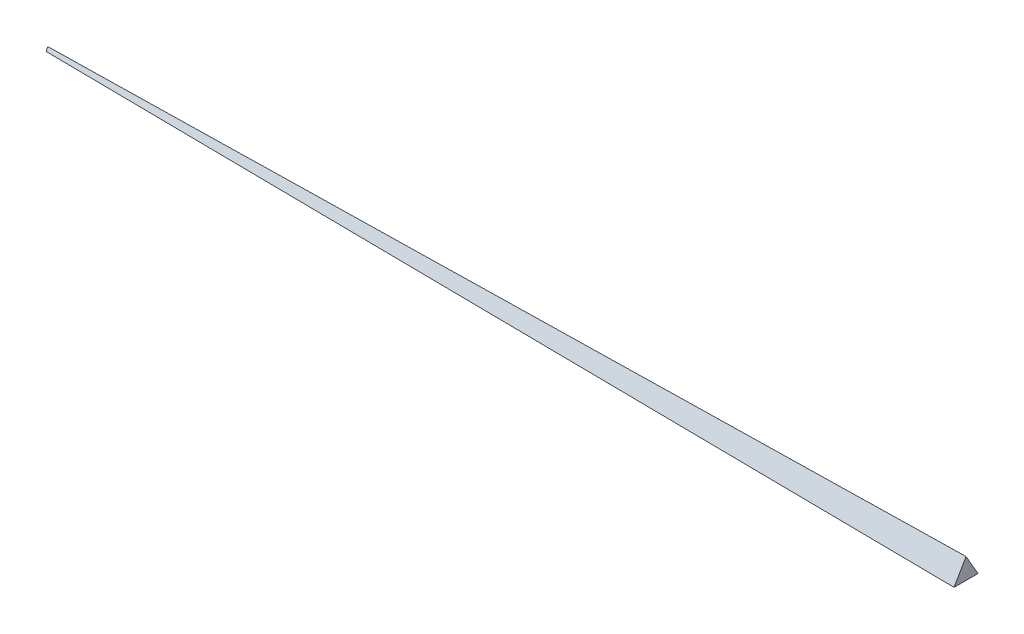
ISO-10303-21;
HEADER;
FILE_DESCRIPTION(('STEP AP214'),'2;1');
FILE_NAME('part.step','',(''),(''),'','','');
FILE_SCHEMA(('AUTOMOTIVE_DESIGN { 1 0 10303 214 1 1 1 1 }'));
ENDSEC;
DATA;
#1=APPLICATION_CONTEXT('core data for automotive mechanical design processes');
#2=APPLICATION_PROTOCOL_DEFINITION('international standard','automotive_design',2000,#1);
#3=PRODUCT_CONTEXT('',#1,'mechanical');
#4=PRODUCT('Part','Part','',(#3));
#5=PRODUCT_RELATED_PRODUCT_CATEGORY('part','',(#4));
#6=PRODUCT_DEFINITION_FORMATION('','',#4);
#7=PRODUCT_DEFINITION_CONTEXT('part definition',#1,'design');
#8=PRODUCT_DEFINITION('design','',#6,#7);
#9=PRODUCT_DEFINITION_SHAPE('','',#8);
#10=(LENGTH_UNIT() NAMED_UNIT(*) SI_UNIT(.MILLI.,.METRE.));
#11=(NAMED_UNIT(*) PLANE_ANGLE_UNIT() SI_UNIT($,.RADIAN.));
#12=(NAMED_UNIT(*) SI_UNIT($,.STERADIAN.) SOLID_ANGLE_UNIT());
#13=UNCERTAINTY_MEASURE_WITH_UNIT(LENGTH_MEASURE(1.E-05),#10,'distance_accuracy_value','');
#14=(GEOMETRIC_REPRESENTATION_CONTEXT(3) GLOBAL_UNCERTAINTY_ASSIGNED_CONTEXT((#13)) GLOBAL_UNIT_ASSIGNED_CONTEXT((#10,
#11,#12)) REPRESENTATION_CONTEXT('',''));
#15=CARTESIAN_POINT('',(0.,0.,0.));
#16=DIRECTION('',(0.,0.,1.));
#17=DIRECTION('',(1.,0.,0.));
#18=AXIS2_PLACEMENT_3D('',#15,#16,#17);
#19=CARTESIAN_POINT('',(7315.,0.,0.));
#20=DIRECTION('',(1.,0.,0.));
#21=DIRECTION('',(0.,0.,-1.));
#22=AXIS2_PLACEMENT_3D('',#19,#20,#21);
#23=PLANE('',#22);
#24=DIRECTION('',(0.,0.865993641625582,-0.500055009638002));
#25=VECTOR('',#24,1.);
#26=CARTESIAN_POINT('',(7315.,0.,95.45));
#27=LINE('',#26,#25);
#28=CARTESIAN_POINT('',(7315.,0.,95.45));
#29=VERTEX_POINT('',#28);
#30=CARTESIAN_POINT('',(7315.,165.3,0.));
#31=VERTEX_POINT('',#30);
#32=EDGE_CURVE('E232',#29,#31,#27,.T.);
#33=ORIENTED_EDGE('',*,*,#32,.F.);
#34=DIRECTION('',(0.,0.,1.));
#35=VECTOR('',#34,1.);
#36=CARTESIAN_POINT('',(7315.,0.,0.));
#37=LINE('',#36,#35);
#38=CARTESIAN_POINT('',(7315.,0.,0.));
#39=VERTEX_POINT('',#38);
#40=EDGE_CURVE('E141',#39,#29,#37,.T.);
#41=ORIENTED_EDGE('',*,*,#40,.F.);
#42=DIRECTION('',(0.,0.,1.));
#43=VECTOR('',#42,1.);
#44=CARTESIAN_POINT('',(7315.,0.,0.));
#45=LINE('',#44,#43);
#46=CARTESIAN_POINT('',(7315.,0.,-95.45));
#47=VERTEX_POINT('',#46);
#48=EDGE_CURVE('E174',#47,#39,#45,.T.);
#49=ORIENTED_EDGE('',*,*,#48,.F.);
#50=DIRECTION('',(0.,-0.865993641625582,-0.500055009638002));
#51=VECTOR('',#50,1.);
#52=CARTESIAN_POINT('',(7315.,0.,-95.45));
#53=LINE('',#52,#51);
#54=EDGE_CURVE('E300',#31,#47,#53,.T.);
#55=ORIENTED_EDGE('',*,*,#54,.F.);
#56=EDGE_LOOP('',(#33,#41,#49,#55));
#57=FACE_BOUND('',#56,.T.);
#58=ADVANCED_FACE('F103',(#57),#23,.T.);
#59=CARTESIAN_POINT('',(0.,0.,0.));
#60=DIRECTION('',(1.,0.,0.));
#61=DIRECTION('',(0.,0.,-1.));
#62=AXIS2_PLACEMENT_3D('',#59,#60,#61);
#63=PLANE('',#62);
#64=DIRECTION('',(0.,0.,-1.));
#65=VECTOR('',#64,1.);
#66=CARTESIAN_POINT('',(0.,0.,0.));
#67=LINE('',#66,#65);
#68=CARTESIAN_POINT('',(0.,0.,0.));
#69=VERTEX_POINT('',#68);
#70=CARTESIAN_POINT('',(0.,0.,-14.75));
#71=VERTEX_POINT('',#70);
#72=EDGE_CURVE('E158',#69,#71,#67,.T.);
#73=ORIENTED_EDGE('',*,*,#72,.F.);
#74=DIRECTION('',(0.,0.,-1.));
#75=VECTOR('',#74,1.);
#76=CARTESIAN_POINT('',(0.,0.,0.));
#77=LINE('',#76,#75);
#78=CARTESIAN_POINT('',(0.,0.,14.75));
#79=VERTEX_POINT('',#78);
#80=EDGE_CURVE('E13',#79,#69,#77,.T.);
#81=ORIENTED_EDGE('',*,*,#80,.F.);
#82=DIRECTION('',(0.,-0.865619895441959,0.500701704226231));
#83=VECTOR('',#82,1.);
#84=CARTESIAN_POINT('',(0.,0.,14.75));
#85=LINE('',#84,#83);
#86=CARTESIAN_POINT('',(0.,25.5,0.));
#87=VERTEX_POINT('',#86);
#88=EDGE_CURVE('E115',#87,#79,#85,.T.);
#89=ORIENTED_EDGE('',*,*,#88,.F.);
#90=DIRECTION('',(0.,0.865619895441959,0.500701704226231));
#91=VECTOR('',#90,1.);
#92=CARTESIAN_POINT('',(0.,0.,-14.75));
#93=LINE('',#92,#91);
#94=EDGE_CURVE('E124',#71,#87,#93,.T.);
#95=ORIENTED_EDGE('',*,*,#94,.F.);
#96=EDGE_LOOP('',(#73,#81,#89,#95));
#97=FACE_BOUND('',#96,.T.);
#98=ADVANCED_FACE('F156',(#97),#63,.F.);
#99=CARTESIAN_POINT('',(0.,0.,-14.75));
#100=CARTESIAN_POINT('',(2438.33333333333,0.,-41.65));
#101=CARTESIAN_POINT('',(4876.66666666667,0.,-68.55));
#102=CARTESIAN_POINT('',(7315.,0.,-95.45));
#103=CARTESIAN_POINT('',(0.,2.125,-13.5208333333333));
#104=CARTESIAN_POINT('',(2438.33333333333,6.00833333333332,-38.1791666666667));
#105=CARTESIAN_POINT('',(4876.66666666667,9.89166666666665,-62.8375));
#106=CARTESIAN_POINT('',(7315.,13.775,-87.4958333333333));
#107=CARTESIAN_POINT('',(0.,6.37500000000001,-11.0625));
#108=CARTESIAN_POINT('',(2438.33333333334,18.025,-31.2375));
#109=CARTESIAN_POINT('',(4876.66666666667,29.6750000000001,-51.4125000000001));
#110=CARTESIAN_POINT('',(7315.00000000001,41.3250000000001,-71.5875));
#111=CARTESIAN_POINT('',(0.,12.75,-7.37499999999997));
#112=CARTESIAN_POINT('',(2438.33333333333,36.05,-20.825));
#113=CARTESIAN_POINT('',(4876.66666666666,59.3499999999999,-34.275));
#114=CARTESIAN_POINT('',(7314.99999999999,82.6499999999999,-47.725));
#115=CARTESIAN_POINT('',(0.,19.125,-3.68750000000001));
#116=CARTESIAN_POINT('',(2438.33333333333,54.075,-10.4125));
#117=CARTESIAN_POINT('',(4876.66666666667,89.025,-17.1375));
#118=CARTESIAN_POINT('',(7315.,123.975,-23.8625));
#119=CARTESIAN_POINT('',(0.,23.375,-1.22916666666666));
#120=CARTESIAN_POINT('',(2438.33333333333,66.0916666666667,-3.47083333333334));
#121=CARTESIAN_POINT('',(4876.66666666667,108.808333333333,-5.71250000000001));
#122=CARTESIAN_POINT('',(7315.,151.525,-7.95416666666669));
#123=CARTESIAN_POINT('',(0.,25.5,0.));
#124=CARTESIAN_POINT('',(2438.33333333333,72.1,0.));
#125=CARTESIAN_POINT('',(4876.66666666667,118.7,0.));
#126=CARTESIAN_POINT('',(7315.,165.3,0.));
#127=B_SPLINE_SURFACE_WITH_KNOTS('',3,3,((#99,#100,#101,#102),(#103,#104,#105,#106),(#107,#108,
#109,#110),(#111,#112,#113,#114),(#115,#116,#117,#118),(#119,#120,#121,#122),(#123,#124,#125,
#126)),.UNSPECIFIED.,.F.,.F.,.F.,(4,1,1,1,4),(4,4),(0.666750709304579,0.750063031978434,
0.833375354652289,0.916687677326145,1.),(0.,1.),.UNSPECIFIED.);
#128=CARTESIAN_POINT('',(0.,25.5,0.));
#129=CARTESIAN_POINT('',(2438.33333333333,72.1,0.));
#130=CARTESIAN_POINT('',(4876.66666666667,118.7,0.));
#131=CARTESIAN_POINT('',(7315.,165.3,0.));
#132=B_SPLINE_CURVE_WITH_KNOTS('',3,(#128,#129,#130,#131),.UNSPECIFIED.,.F.,.F.,(4,4),(0.,1.),.UNSPECIFIED.);
#133=EDGE_CURVE('E166',#87,#31,#132,.T.);
#134=CARTESIAN_POINT('',(0.,0.,-14.75));
#135=CARTESIAN_POINT('',(2438.33333333333,0.,-41.65));
#136=CARTESIAN_POINT('',(4876.66666666667,0.,-68.55));
#137=CARTESIAN_POINT('',(7315.,0.,-95.45));
#138=B_SPLINE_CURVE_WITH_KNOTS('',3,(#134,#135,#136,#137),.UNSPECIFIED.,.F.,.F.,(4,4),(0.,1.),.UNSPECIFIED.);
#139=EDGE_CURVE('E170',#71,#47,#138,.T.);
#140=ORIENTED_EDGE('',*,*,#94,.T.);
#141=ORIENTED_EDGE('',*,*,#133,.T.);
#142=ORIENTED_EDGE('',*,*,#54,.T.);
#143=ORIENTED_EDGE('',*,*,#139,.F.);
#144=EDGE_LOOP('',(#140,#141,#142,#143));
#145=FACE_BOUND('',#144,.T.);
#146=ADVANCED_FACE('F198',(#145),#127,.T.);
#147=CARTESIAN_POINT('',(0.,0.,14.75));
#148=DIRECTION('',(0.,-1.,0.));
#149=DIRECTION('',(0.,0.,-1.));
#150=AXIS2_PLACEMENT_3D('',#147,#148,#149);
#151=PLANE('',#150);
#152=ORIENTED_EDGE('',*,*,#80,.T.);
#153=ORIENTED_EDGE('',*,*,#72,.T.);
#154=ORIENTED_EDGE('',*,*,#139,.T.);
#155=ORIENTED_EDGE('',*,*,#48,.T.);
#156=ORIENTED_EDGE('',*,*,#40,.T.);
#157=CARTESIAN_POINT('',(0.,0.,14.75));
#158=CARTESIAN_POINT('',(2438.33333333333,0.,41.65));
#159=CARTESIAN_POINT('',(4876.66666666667,0.,68.55));
#160=CARTESIAN_POINT('',(7315.,0.,95.45));
#161=B_SPLINE_CURVE_WITH_KNOTS('',3,(#157,#158,#159,#160),.UNSPECIFIED.,.F.,.F.,(4,4),(0.,1.),.UNSPECIFIED.);
#162=EDGE_CURVE('E150',#79,#29,#161,.T.);
#163=ORIENTED_EDGE('',*,*,#162,.F.);
#164=EDGE_LOOP('',(#152,#153,#154,#155,#156,#163));
#165=FACE_BOUND('',#164,.T.);
#166=ADVANCED_FACE('F105',(#165),#151,.T.);
#167=CARTESIAN_POINT('',(0.,25.5,0.));
#168=CARTESIAN_POINT('',(2438.33333333333,72.1,0.));
#169=CARTESIAN_POINT('',(4876.66666666667,118.7,0.));
#170=CARTESIAN_POINT('',(7315.,165.3,0.));
#171=CARTESIAN_POINT('',(0.,23.375,1.22916666666666));
#172=CARTESIAN_POINT('',(2438.33333333333,66.0916666666667,3.47083333333334));
#173=CARTESIAN_POINT('',(4876.66666666667,108.808333333333,5.71250000000001));
#174=CARTESIAN_POINT('',(7315.,151.525,7.95416666666669));
#175=CARTESIAN_POINT('',(0.,19.125,3.68749999999999));
#176=CARTESIAN_POINT('',(2438.33333333333,54.075,10.4125));
#177=CARTESIAN_POINT('',(4876.66666666667,89.0250000000001,17.1375));
#178=CARTESIAN_POINT('',(7315.,123.975,23.8625));
#179=CARTESIAN_POINT('',(0.,12.75,7.37500000000001));
#180=CARTESIAN_POINT('',(2438.33333333333,36.0499999999999,20.825));
#181=CARTESIAN_POINT('',(4876.66666666667,59.3499999999999,34.275));
#182=CARTESIAN_POINT('',(7315.,82.6499999999999,47.725));
#183=CARTESIAN_POINT('',(0.,6.375,11.0625));
#184=CARTESIAN_POINT('',(2438.33333333333,18.025,31.2375));
#185=CARTESIAN_POINT('',(4876.66666666666,29.675,51.4125));
#186=CARTESIAN_POINT('',(7314.99999999999,41.3250000000001,71.5875));
#187=CARTESIAN_POINT('',(0.,2.125,13.5208333333333));
#188=CARTESIAN_POINT('',(2438.33333333333,6.00833333333333,38.1791666666667));
#189=CARTESIAN_POINT('',(4876.66666666667,9.89166666666667,62.8375));
#190=CARTESIAN_POINT('',(7315.,13.775,87.4958333333333));
#191=CARTESIAN_POINT('',(0.,0.,14.75));
#192=CARTESIAN_POINT('',(2438.33333333333,0.,41.65));
#193=CARTESIAN_POINT('',(4876.66666666667,0.,68.55));
#194=CARTESIAN_POINT('',(7315.,0.,95.45));
#195=B_SPLINE_SURFACE_WITH_KNOTS('',3,3,((#167,#168,#169,#170),(#171,#172,#173,#174),(#175,#176,
#177,#178),(#179,#180,#181,#182),(#183,#184,#185,#186),(#187,#188,#189,#190),(#191,#192,#193,
#194)),.UNSPECIFIED.,.F.,.F.,.F.,(4,1,1,1,4),(4,4),(0.,0.0833123226738553,0.166624645347711,
0.249936968021566,0.333249290695421),(0.,1.),.UNSPECIFIED.);
#196=ORIENTED_EDGE('',*,*,#88,.T.);
#197=ORIENTED_EDGE('',*,*,#162,.T.);
#198=ORIENTED_EDGE('',*,*,#32,.T.);
#199=ORIENTED_EDGE('',*,*,#133,.F.);
#200=EDGE_LOOP('',(#196,#197,#198,#199));
#201=FACE_BOUND('',#200,.T.);
#202=ADVANCED_FACE('F164',(#201),#195,.T.);
#203=CLOSED_SHELL('',(#58,#98,#146,#166,#202));
#204=MANIFOLD_SOLID_BREP('B2',#203);
#205=ADVANCED_BREP_SHAPE_REPRESENTATION('',(#18,#204),#14);
#206=SHAPE_DEFINITION_REPRESENTATION(#9,#205);
ENDSEC;
END-ISO-10303-21;
